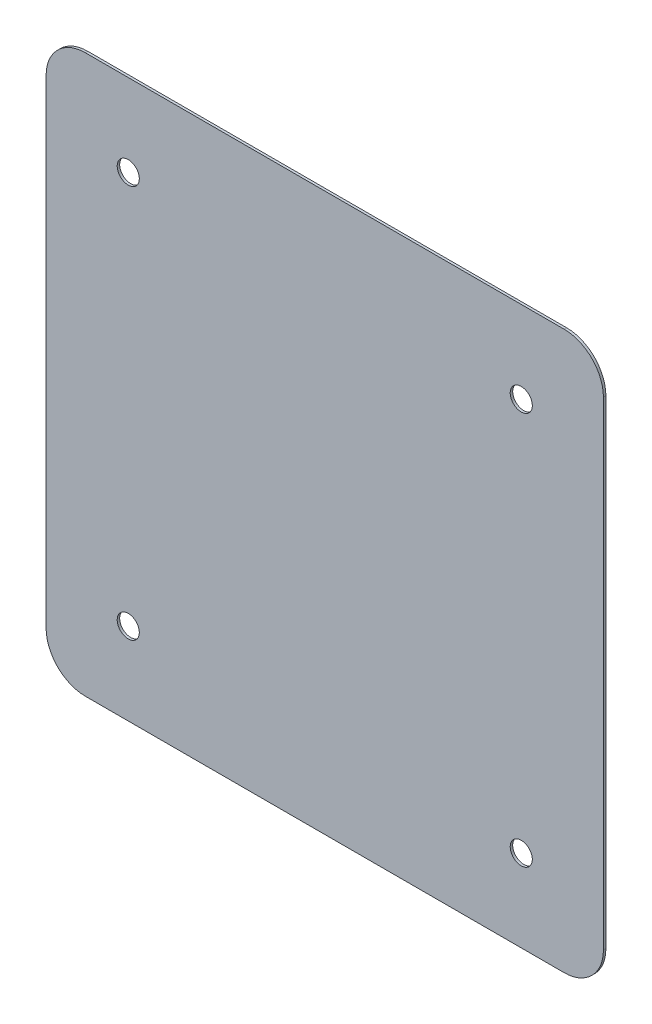
ISO-10303-21;
HEADER;
FILE_DESCRIPTION(('STEP AP214'),'2;1');
FILE_NAME('part.step','',(''),(''),'','','');
FILE_SCHEMA(('AUTOMOTIVE_DESIGN { 1 0 10303 214 1 1 1 1 }'));
ENDSEC;
DATA;
#1=APPLICATION_CONTEXT('core data for automotive mechanical design processes');
#2=APPLICATION_PROTOCOL_DEFINITION('international standard','automotive_design',2000,#1);
#3=PRODUCT_CONTEXT('',#1,'mechanical');
#4=PRODUCT('Part','Part','',(#3));
#5=PRODUCT_RELATED_PRODUCT_CATEGORY('part','',(#4));
#6=PRODUCT_DEFINITION_FORMATION('','',#4);
#7=PRODUCT_DEFINITION_CONTEXT('part definition',#1,'design');
#8=PRODUCT_DEFINITION('design','',#6,#7);
#9=PRODUCT_DEFINITION_SHAPE('','',#8);
#10=(LENGTH_UNIT() NAMED_UNIT(*) SI_UNIT(.MILLI.,.METRE.));
#11=(NAMED_UNIT(*) PLANE_ANGLE_UNIT() SI_UNIT($,.RADIAN.));
#12=(NAMED_UNIT(*) SI_UNIT($,.STERADIAN.) SOLID_ANGLE_UNIT());
#13=UNCERTAINTY_MEASURE_WITH_UNIT(LENGTH_MEASURE(1.E-05),#10,'distance_accuracy_value','');
#14=(GEOMETRIC_REPRESENTATION_CONTEXT(3) GLOBAL_UNCERTAINTY_ASSIGNED_CONTEXT((#13)) GLOBAL_UNIT_ASSIGNED_CONTEXT((#10,
#11,#12)) REPRESENTATION_CONTEXT('',''));
#15=CARTESIAN_POINT('',(0.,0.,0.));
#16=DIRECTION('',(0.,0.,1.));
#17=DIRECTION('',(1.,0.,0.));
#18=AXIS2_PLACEMENT_3D('',#15,#16,#17);
#19=CARTESIAN_POINT('',(-77.343,77.343,0.8));
#20=DIRECTION('',(0.,0.,-1.));
#21=DIRECTION('',(-1.,0.,0.));
#22=AXIS2_PLACEMENT_3D('',#19,#20,#21);
#23=PLANE('',#22);
#24=CARTESIAN_POINT('',(-77.343,77.343,0.8));
#25=DIRECTION('',(0.,0.,1.));
#26=DIRECTION('',(-1.,0.,0.));
#27=AXIS2_PLACEMENT_3D('',#24,#25,#26);
#28=CIRCLE('',#27,12.7);
#29=CARTESIAN_POINT('',(-77.343,90.043,0.8));
#30=VERTEX_POINT('',#29);
#31=CARTESIAN_POINT('',(-90.043,77.343,0.8));
#32=VERTEX_POINT('',#31);
#33=EDGE_CURVE('E168',#30,#32,#28,.T.);
#34=ORIENTED_EDGE('',*,*,#33,.T.);
#35=DIRECTION('',(0.,-1.,0.));
#36=VECTOR('',#35,1.);
#37=CARTESIAN_POINT('',(-90.043,-77.343,0.8));
#38=LINE('',#37,#36);
#39=CARTESIAN_POINT('',(-90.043,-77.343,0.8));
#40=VERTEX_POINT('',#39);
#41=EDGE_CURVE('E104',#32,#40,#38,.T.);
#42=ORIENTED_EDGE('',*,*,#41,.T.);
#43=CARTESIAN_POINT('',(-77.343,-77.343,0.8));
#44=DIRECTION('',(0.,0.,1.));
#45=DIRECTION('',(-1.,0.,0.));
#46=AXIS2_PLACEMENT_3D('',#43,#44,#45);
#47=CIRCLE('',#46,12.7);
#48=CARTESIAN_POINT('',(-77.343,-90.043,0.8));
#49=VERTEX_POINT('',#48);
#50=EDGE_CURVE('E189',#40,#49,#47,.T.);
#51=ORIENTED_EDGE('',*,*,#50,.T.);
#52=DIRECTION('',(1.,0.,0.));
#53=VECTOR('',#52,1.);
#54=CARTESIAN_POINT('',(77.343,-90.043,0.8));
#55=LINE('',#54,#53);
#56=CARTESIAN_POINT('',(77.343,-90.043,0.8));
#57=VERTEX_POINT('',#56);
#58=EDGE_CURVE('E203',#49,#57,#55,.T.);
#59=ORIENTED_EDGE('',*,*,#58,.T.);
#60=CARTESIAN_POINT('',(77.343,-77.343,0.8));
#61=DIRECTION('',(0.,0.,1.));
#62=DIRECTION('',(-1.,0.,0.));
#63=AXIS2_PLACEMENT_3D('',#60,#61,#62);
#64=CIRCLE('',#63,12.7);
#65=CARTESIAN_POINT('',(90.043,-77.343,0.8));
#66=VERTEX_POINT('',#65);
#67=EDGE_CURVE('E123',#57,#66,#64,.T.);
#68=ORIENTED_EDGE('',*,*,#67,.T.);
#69=DIRECTION('',(0.,1.,0.));
#70=VECTOR('',#69,1.);
#71=CARTESIAN_POINT('',(90.043,77.343,0.8));
#72=LINE('',#71,#70);
#73=CARTESIAN_POINT('',(90.043,77.343,0.8));
#74=VERTEX_POINT('',#73);
#75=EDGE_CURVE('E117',#66,#74,#72,.T.);
#76=ORIENTED_EDGE('',*,*,#75,.T.);
#77=CARTESIAN_POINT('',(77.343,77.343,0.8));
#78=DIRECTION('',(0.,0.,1.));
#79=DIRECTION('',(-1.,0.,0.));
#80=AXIS2_PLACEMENT_3D('',#77,#78,#79);
#81=CIRCLE('',#80,12.7);
#82=CARTESIAN_POINT('',(77.343,90.043,0.8));
#83=VERTEX_POINT('',#82);
#84=EDGE_CURVE('E121',#74,#83,#81,.T.);
#85=ORIENTED_EDGE('',*,*,#84,.T.);
#86=DIRECTION('',(-1.,0.,0.));
#87=VECTOR('',#86,1.);
#88=CARTESIAN_POINT('',(-77.343,90.043,0.8));
#89=LINE('',#88,#87);
#90=EDGE_CURVE('E61',#83,#30,#89,.T.);
#91=ORIENTED_EDGE('',*,*,#90,.T.);
#92=EDGE_LOOP('',(#34,#42,#51,#59,#68,#76,#85,#91));
#93=FACE_BOUND('',#92,.T.);
#94=CARTESIAN_POINT('',(-63.50000000009,63.5,0.8));
#95=DIRECTION('',(0.,0.,1.));
#96=DIRECTION('',(1.,0.,0.));
#97=AXIS2_PLACEMENT_3D('',#94,#95,#96);
#98=CIRCLE('',#97,3.57);
#99=CARTESIAN_POINT('',(-59.93000000009,63.5,0.8));
#100=VERTEX_POINT('',#99);
#101=EDGE_CURVE('E150',#100,#100,#98,.T.);
#102=ORIENTED_EDGE('',*,*,#101,.F.);
#103=EDGE_LOOP('',(#102));
#104=FACE_BOUND('',#103,.T.);
#105=CARTESIAN_POINT('',(63.49999999991,63.5,0.8));
#106=DIRECTION('',(0.,0.,1.));
#107=DIRECTION('',(1.,0.,0.));
#108=AXIS2_PLACEMENT_3D('',#105,#106,#107);
#109=CIRCLE('',#108,3.57);
#110=CARTESIAN_POINT('',(67.06999999991,63.5,0.8));
#111=VERTEX_POINT('',#110);
#112=EDGE_CURVE('E217',#111,#111,#109,.T.);
#113=ORIENTED_EDGE('',*,*,#112,.F.);
#114=EDGE_LOOP('',(#113));
#115=FACE_BOUND('',#114,.T.);
#116=CARTESIAN_POINT('',(63.4999999999113,-63.5,0.8));
#117=DIRECTION('',(0.,0.,1.));
#118=DIRECTION('',(1.,0.,0.));
#119=AXIS2_PLACEMENT_3D('',#116,#117,#118);
#120=CIRCLE('',#119,3.57);
#121=CARTESIAN_POINT('',(67.0699999999113,-63.5,0.8));
#122=VERTEX_POINT('',#121);
#123=EDGE_CURVE('E225',#122,#122,#120,.T.);
#124=ORIENTED_EDGE('',*,*,#123,.F.);
#125=EDGE_LOOP('',(#124));
#126=FACE_BOUND('',#125,.T.);
#127=CARTESIAN_POINT('',(-63.5000000000887,-63.5,0.8));
#128=DIRECTION('',(0.,0.,1.));
#129=DIRECTION('',(1.,0.,0.));
#130=AXIS2_PLACEMENT_3D('',#127,#128,#129);
#131=CIRCLE('',#130,3.57);
#132=CARTESIAN_POINT('',(-59.9300000000887,-63.5,0.8));
#133=VERTEX_POINT('',#132);
#134=EDGE_CURVE('E233',#133,#133,#131,.T.);
#135=ORIENTED_EDGE('',*,*,#134,.F.);
#136=EDGE_LOOP('',(#135));
#137=FACE_BOUND('',#136,.T.);
#138=ADVANCED_FACE('F43',(#93,#104,#115,#126,#137),#23,.F.);
#139=CARTESIAN_POINT('',(-77.343,77.343,0.));
#140=DIRECTION('',(0.,0.,-1.));
#141=DIRECTION('',(-1.,0.,0.));
#142=AXIS2_PLACEMENT_3D('',#139,#140,#141);
#143=PLANE('',#142);
#144=CARTESIAN_POINT('',(63.4999999999113,-63.5,0.));
#145=DIRECTION('',(0.,0.,1.));
#146=DIRECTION('',(1.,0.,0.));
#147=AXIS2_PLACEMENT_3D('',#144,#145,#146);
#148=CIRCLE('',#147,3.57);
#149=CARTESIAN_POINT('',(67.0699999999113,-63.5,0.));
#150=VERTEX_POINT('',#149);
#151=EDGE_CURVE('E229',#150,#150,#148,.T.);
#152=ORIENTED_EDGE('',*,*,#151,.T.);
#153=EDGE_LOOP('',(#152));
#154=FACE_BOUND('',#153,.T.);
#155=CARTESIAN_POINT('',(-63.50000000009,63.5,0.));
#156=DIRECTION('',(0.,0.,1.));
#157=DIRECTION('',(1.,0.,0.));
#158=AXIS2_PLACEMENT_3D('',#155,#156,#157);
#159=CIRCLE('',#158,3.57);
#160=CARTESIAN_POINT('',(-59.93000000009,63.5,0.));
#161=VERTEX_POINT('',#160);
#162=EDGE_CURVE('E213',#161,#161,#159,.T.);
#163=ORIENTED_EDGE('',*,*,#162,.T.);
#164=EDGE_LOOP('',(#163));
#165=FACE_BOUND('',#164,.T.);
#166=CARTESIAN_POINT('',(-77.343,77.343,0.));
#167=DIRECTION('',(0.,0.,1.));
#168=DIRECTION('',(-1.,0.,0.));
#169=AXIS2_PLACEMENT_3D('',#166,#167,#168);
#170=CIRCLE('',#169,12.7);
#171=CARTESIAN_POINT('',(-77.343,90.043,0.));
#172=VERTEX_POINT('',#171);
#173=CARTESIAN_POINT('',(-90.043,77.343,0.));
#174=VERTEX_POINT('',#173);
#175=EDGE_CURVE('E145',#172,#174,#170,.T.);
#176=ORIENTED_EDGE('',*,*,#175,.F.);
#177=DIRECTION('',(-1.,0.,0.));
#178=VECTOR('',#177,1.);
#179=CARTESIAN_POINT('',(-77.343,90.043,0.));
#180=LINE('',#179,#178);
#181=CARTESIAN_POINT('',(77.343,90.043,0.));
#182=VERTEX_POINT('',#181);
#183=EDGE_CURVE('E96',#182,#172,#180,.T.);
#184=ORIENTED_EDGE('',*,*,#183,.F.);
#185=CARTESIAN_POINT('',(77.343,77.343,0.));
#186=DIRECTION('',(0.,0.,1.));
#187=DIRECTION('',(-1.,0.,0.));
#188=AXIS2_PLACEMENT_3D('',#185,#186,#187);
#189=CIRCLE('',#188,12.7);
#190=CARTESIAN_POINT('',(90.043,77.343,0.));
#191=VERTEX_POINT('',#190);
#192=EDGE_CURVE('E90',#191,#182,#189,.T.);
#193=ORIENTED_EDGE('',*,*,#192,.F.);
#194=DIRECTION('',(0.,1.,0.));
#195=VECTOR('',#194,1.);
#196=CARTESIAN_POINT('',(90.043,77.343,0.));
#197=LINE('',#196,#195);
#198=CARTESIAN_POINT('',(90.043,-77.343,0.));
#199=VERTEX_POINT('',#198);
#200=EDGE_CURVE('E132',#199,#191,#197,.T.);
#201=ORIENTED_EDGE('',*,*,#200,.F.);
#202=CARTESIAN_POINT('',(77.343,-77.343,0.));
#203=DIRECTION('',(0.,0.,1.));
#204=DIRECTION('',(-1.,0.,0.));
#205=AXIS2_PLACEMENT_3D('',#202,#203,#204);
#206=CIRCLE('',#205,12.7);
#207=CARTESIAN_POINT('',(77.343,-90.043,0.));
#208=VERTEX_POINT('',#207);
#209=EDGE_CURVE('E159',#208,#199,#206,.T.);
#210=ORIENTED_EDGE('',*,*,#209,.F.);
#211=DIRECTION('',(1.,0.,0.));
#212=VECTOR('',#211,1.);
#213=CARTESIAN_POINT('',(77.343,-90.043,0.));
#214=LINE('',#213,#212);
#215=CARTESIAN_POINT('',(-77.343,-90.043,0.));
#216=VERTEX_POINT('',#215);
#217=EDGE_CURVE('E156',#216,#208,#214,.T.);
#218=ORIENTED_EDGE('',*,*,#217,.F.);
#219=CARTESIAN_POINT('',(-77.343,-77.343,0.));
#220=DIRECTION('',(0.,0.,1.));
#221=DIRECTION('',(-1.,0.,0.));
#222=AXIS2_PLACEMENT_3D('',#219,#220,#221);
#223=CIRCLE('',#222,12.7);
#224=CARTESIAN_POINT('',(-90.043,-77.343,0.));
#225=VERTEX_POINT('',#224);
#226=EDGE_CURVE('E153',#225,#216,#223,.T.);
#227=ORIENTED_EDGE('',*,*,#226,.F.);
#228=DIRECTION('',(0.,-1.,0.));
#229=VECTOR('',#228,1.);
#230=CARTESIAN_POINT('',(-90.043,-77.343,0.));
#231=LINE('',#230,#229);
#232=EDGE_CURVE('E149',#174,#225,#231,.T.);
#233=ORIENTED_EDGE('',*,*,#232,.F.);
#234=EDGE_LOOP('',(#176,#184,#193,#201,#210,#218,#227,#233));
#235=FACE_BOUND('',#234,.T.);
#236=CARTESIAN_POINT('',(63.49999999991,63.5,0.));
#237=DIRECTION('',(0.,0.,1.));
#238=DIRECTION('',(1.,0.,0.));
#239=AXIS2_PLACEMENT_3D('',#236,#237,#238);
#240=CIRCLE('',#239,3.57);
#241=CARTESIAN_POINT('',(67.06999999991,63.5,0.));
#242=VERTEX_POINT('',#241);
#243=EDGE_CURVE('E221',#242,#242,#240,.T.);
#244=ORIENTED_EDGE('',*,*,#243,.T.);
#245=EDGE_LOOP('',(#244));
#246=FACE_BOUND('',#245,.T.);
#247=CARTESIAN_POINT('',(-63.5000000000887,-63.5,0.));
#248=DIRECTION('',(0.,0.,1.));
#249=DIRECTION('',(1.,0.,0.));
#250=AXIS2_PLACEMENT_3D('',#247,#248,#249);
#251=CIRCLE('',#250,3.57);
#252=CARTESIAN_POINT('',(-59.9300000000887,-63.5,0.));
#253=VERTEX_POINT('',#252);
#254=EDGE_CURVE('E237',#253,#253,#251,.T.);
#255=ORIENTED_EDGE('',*,*,#254,.T.);
#256=EDGE_LOOP('',(#255));
#257=FACE_BOUND('',#256,.T.);
#258=ADVANCED_FACE('F193',(#154,#165,#235,#246,#257),#143,.T.);
#259=CARTESIAN_POINT('',(-77.343,77.343,0.8));
#260=DIRECTION('',(0.,0.,-1.));
#261=DIRECTION('',(-1.,0.,0.));
#262=AXIS2_PLACEMENT_3D('',#259,#260,#261);
#263=CYLINDRICAL_SURFACE('',#262,12.7);
#264=ORIENTED_EDGE('',*,*,#175,.T.);
#265=DIRECTION('',(0.,0.,-1.));
#266=VECTOR('',#265,1.);
#267=CARTESIAN_POINT('',(-90.043,77.343,0.8));
#268=LINE('',#267,#266);
#269=EDGE_CURVE('E11',#32,#174,#268,.T.);
#270=ORIENTED_EDGE('',*,*,#269,.F.);
#271=ORIENTED_EDGE('',*,*,#33,.F.);
#272=DIRECTION('',(0.,0.,-1.));
#273=VECTOR('',#272,1.);
#274=CARTESIAN_POINT('',(-77.343,90.043,0.8));
#275=LINE('',#274,#273);
#276=EDGE_CURVE('E141',#30,#172,#275,.T.);
#277=ORIENTED_EDGE('',*,*,#276,.T.);
#278=EDGE_LOOP('',(#264,#270,#271,#277));
#279=FACE_BOUND('',#278,.T.);
#280=ADVANCED_FACE('F45',(#279),#263,.T.);
#281=CARTESIAN_POINT('',(-90.043,-77.343,0.8));
#282=DIRECTION('',(1.,0.,0.));
#283=DIRECTION('',(0.,0.,-1.));
#284=AXIS2_PLACEMENT_3D('',#281,#282,#283);
#285=PLANE('',#284);
#286=ORIENTED_EDGE('',*,*,#232,.T.);
#287=DIRECTION('',(0.,0.,-1.));
#288=VECTOR('',#287,1.);
#289=CARTESIAN_POINT('',(-90.043,-77.343,0.8));
#290=LINE('',#289,#288);
#291=EDGE_CURVE('E53',#40,#225,#290,.T.);
#292=ORIENTED_EDGE('',*,*,#291,.F.);
#293=ORIENTED_EDGE('',*,*,#41,.F.);
#294=ORIENTED_EDGE('',*,*,#269,.T.);
#295=EDGE_LOOP('',(#286,#292,#293,#294));
#296=FACE_BOUND('',#295,.T.);
#297=ADVANCED_FACE('F271',(#296),#285,.F.);
#298=CARTESIAN_POINT('',(-77.343,-77.343,0.8));
#299=DIRECTION('',(0.,0.,-1.));
#300=DIRECTION('',(-1.,0.,0.));
#301=AXIS2_PLACEMENT_3D('',#298,#299,#300);
#302=CYLINDRICAL_SURFACE('',#301,12.7);
#303=ORIENTED_EDGE('',*,*,#226,.T.);
#304=DIRECTION('',(0.,0.,-1.));
#305=VECTOR('',#304,1.);
#306=CARTESIAN_POINT('',(-77.343,-90.043,0.8));
#307=LINE('',#306,#305);
#308=EDGE_CURVE('E179',#49,#216,#307,.T.);
#309=ORIENTED_EDGE('',*,*,#308,.F.);
#310=ORIENTED_EDGE('',*,*,#50,.F.);
#311=ORIENTED_EDGE('',*,*,#291,.T.);
#312=EDGE_LOOP('',(#303,#309,#310,#311));
#313=FACE_BOUND('',#312,.T.);
#314=ADVANCED_FACE('F187',(#313),#302,.T.);
#315=CARTESIAN_POINT('',(77.343,-90.043,0.8));
#316=DIRECTION('',(0.,1.,0.));
#317=DIRECTION('',(0.,0.,1.));
#318=AXIS2_PLACEMENT_3D('',#315,#316,#317);
#319=PLANE('',#318);
#320=ORIENTED_EDGE('',*,*,#217,.T.);
#321=DIRECTION('',(0.,0.,-1.));
#322=VECTOR('',#321,1.);
#323=CARTESIAN_POINT('',(77.343,-90.043,0.8));
#324=LINE('',#323,#322);
#325=EDGE_CURVE('E175',#57,#208,#324,.T.);
#326=ORIENTED_EDGE('',*,*,#325,.F.);
#327=ORIENTED_EDGE('',*,*,#58,.F.);
#328=ORIENTED_EDGE('',*,*,#308,.T.);
#329=EDGE_LOOP('',(#320,#326,#327,#328));
#330=FACE_BOUND('',#329,.T.);
#331=ADVANCED_FACE('F198',(#330),#319,.F.);
#332=CARTESIAN_POINT('',(77.343,-77.343,0.8));
#333=DIRECTION('',(0.,0.,-1.));
#334=DIRECTION('',(-1.,0.,0.));
#335=AXIS2_PLACEMENT_3D('',#332,#333,#334);
#336=CYLINDRICAL_SURFACE('',#335,12.7);
#337=ORIENTED_EDGE('',*,*,#209,.T.);
#338=DIRECTION('',(0.,0.,-1.));
#339=VECTOR('',#338,1.);
#340=CARTESIAN_POINT('',(90.043,-77.343,0.8));
#341=LINE('',#340,#339);
#342=EDGE_CURVE('E134',#66,#199,#341,.T.);
#343=ORIENTED_EDGE('',*,*,#342,.F.);
#344=ORIENTED_EDGE('',*,*,#67,.F.);
#345=ORIENTED_EDGE('',*,*,#325,.T.);
#346=EDGE_LOOP('',(#337,#343,#344,#345));
#347=FACE_BOUND('',#346,.T.);
#348=ADVANCED_FACE('F201',(#347),#336,.T.);
#349=CARTESIAN_POINT('',(90.043,77.343,0.8));
#350=DIRECTION('',(-1.,0.,0.));
#351=DIRECTION('',(0.,0.,1.));
#352=AXIS2_PLACEMENT_3D('',#349,#350,#351);
#353=PLANE('',#352);
#354=ORIENTED_EDGE('',*,*,#200,.T.);
#355=DIRECTION('',(0.,0.,-1.));
#356=VECTOR('',#355,1.);
#357=CARTESIAN_POINT('',(90.043,77.343,0.8));
#358=LINE('',#357,#356);
#359=EDGE_CURVE('E129',#74,#191,#358,.T.);
#360=ORIENTED_EDGE('',*,*,#359,.F.);
#361=ORIENTED_EDGE('',*,*,#75,.F.);
#362=ORIENTED_EDGE('',*,*,#342,.T.);
#363=EDGE_LOOP('',(#354,#360,#361,#362));
#364=FACE_BOUND('',#363,.T.);
#365=ADVANCED_FACE('F130',(#364),#353,.F.);
#366=CARTESIAN_POINT('',(77.343,77.343,0.8));
#367=DIRECTION('',(0.,0.,-1.));
#368=DIRECTION('',(-1.,0.,0.));
#369=AXIS2_PLACEMENT_3D('',#366,#367,#368);
#370=CYLINDRICAL_SURFACE('',#369,12.7);
#371=ORIENTED_EDGE('',*,*,#192,.T.);
#372=DIRECTION('',(0.,0.,-1.));
#373=VECTOR('',#372,1.);
#374=CARTESIAN_POINT('',(77.343,90.043,0.8));
#375=LINE('',#374,#373);
#376=EDGE_CURVE('E135',#83,#182,#375,.T.);
#377=ORIENTED_EDGE('',*,*,#376,.F.);
#378=ORIENTED_EDGE('',*,*,#84,.F.);
#379=ORIENTED_EDGE('',*,*,#359,.T.);
#380=EDGE_LOOP('',(#371,#377,#378,#379));
#381=FACE_BOUND('',#380,.T.);
#382=ADVANCED_FACE('F137',(#381),#370,.T.);
#383=CARTESIAN_POINT('',(-77.343,90.043,0.8));
#384=DIRECTION('',(0.,-1.,0.));
#385=DIRECTION('',(0.,0.,-1.));
#386=AXIS2_PLACEMENT_3D('',#383,#384,#385);
#387=PLANE('',#386);
#388=ORIENTED_EDGE('',*,*,#183,.T.);
#389=ORIENTED_EDGE('',*,*,#276,.F.);
#390=ORIENTED_EDGE('',*,*,#90,.F.);
#391=ORIENTED_EDGE('',*,*,#376,.T.);
#392=EDGE_LOOP('',(#388,#389,#390,#391));
#393=FACE_BOUND('',#392,.T.);
#394=ADVANCED_FACE('F259',(#393),#387,.F.);
#395=CARTESIAN_POINT('',(-63.50000000009,63.5,0.8));
#396=DIRECTION('',(0.,0.,-1.));
#397=DIRECTION('',(-1.,0.,0.));
#398=AXIS2_PLACEMENT_3D('',#395,#396,#397);
#399=CYLINDRICAL_SURFACE('',#398,3.57);
#400=ORIENTED_EDGE('',*,*,#101,.T.);
#401=EDGE_LOOP('',(#400));
#402=FACE_BOUND('',#401,.T.);
#403=ORIENTED_EDGE('',*,*,#162,.F.);
#404=EDGE_LOOP('',(#403));
#405=FACE_BOUND('',#404,.T.);
#406=ADVANCED_FACE('F256',(#402,#405),#399,.F.);
#407=CARTESIAN_POINT('',(63.49999999991,63.5,0.8));
#408=DIRECTION('',(0.,0.,-1.));
#409=DIRECTION('',(-1.,0.,0.));
#410=AXIS2_PLACEMENT_3D('',#407,#408,#409);
#411=CYLINDRICAL_SURFACE('',#410,3.57);
#412=ORIENTED_EDGE('',*,*,#112,.T.);
#413=EDGE_LOOP('',(#412));
#414=FACE_BOUND('',#413,.T.);
#415=ORIENTED_EDGE('',*,*,#243,.F.);
#416=EDGE_LOOP('',(#415));
#417=FACE_BOUND('',#416,.T.);
#418=ADVANCED_FACE('F347',(#414,#417),#411,.F.);
#419=CARTESIAN_POINT('',(63.4999999999113,-63.5,0.8));
#420=DIRECTION('',(0.,0.,-1.));
#421=DIRECTION('',(-1.,0.,0.));
#422=AXIS2_PLACEMENT_3D('',#419,#420,#421);
#423=CYLINDRICAL_SURFACE('',#422,3.57);
#424=ORIENTED_EDGE('',*,*,#123,.T.);
#425=EDGE_LOOP('',(#424));
#426=FACE_BOUND('',#425,.T.);
#427=ORIENTED_EDGE('',*,*,#151,.F.);
#428=EDGE_LOOP('',(#427));
#429=FACE_BOUND('',#428,.T.);
#430=ADVANCED_FACE('F356',(#426,#429),#423,.F.);
#431=CARTESIAN_POINT('',(-63.5000000000887,-63.5,0.8));
#432=DIRECTION('',(0.,0.,-1.));
#433=DIRECTION('',(-1.,0.,0.));
#434=AXIS2_PLACEMENT_3D('',#431,#432,#433);
#435=CYLINDRICAL_SURFACE('',#434,3.57);
#436=ORIENTED_EDGE('',*,*,#134,.T.);
#437=EDGE_LOOP('',(#436));
#438=FACE_BOUND('',#437,.T.);
#439=ORIENTED_EDGE('',*,*,#254,.F.);
#440=EDGE_LOOP('',(#439));
#441=FACE_BOUND('',#440,.T.);
#442=ADVANCED_FACE('F245',(#438,#441),#435,.F.);
#443=CLOSED_SHELL('',(#138,#258,#280,#297,#314,#331,#348,#365,#382,#394,#406,#418,#430,#442));
#444=MANIFOLD_SOLID_BREP('B2',#443);
#445=ADVANCED_BREP_SHAPE_REPRESENTATION('',(#18,#444),#14);
#446=SHAPE_DEFINITION_REPRESENTATION(#9,#445);
ENDSEC;
END-ISO-10303-21;
